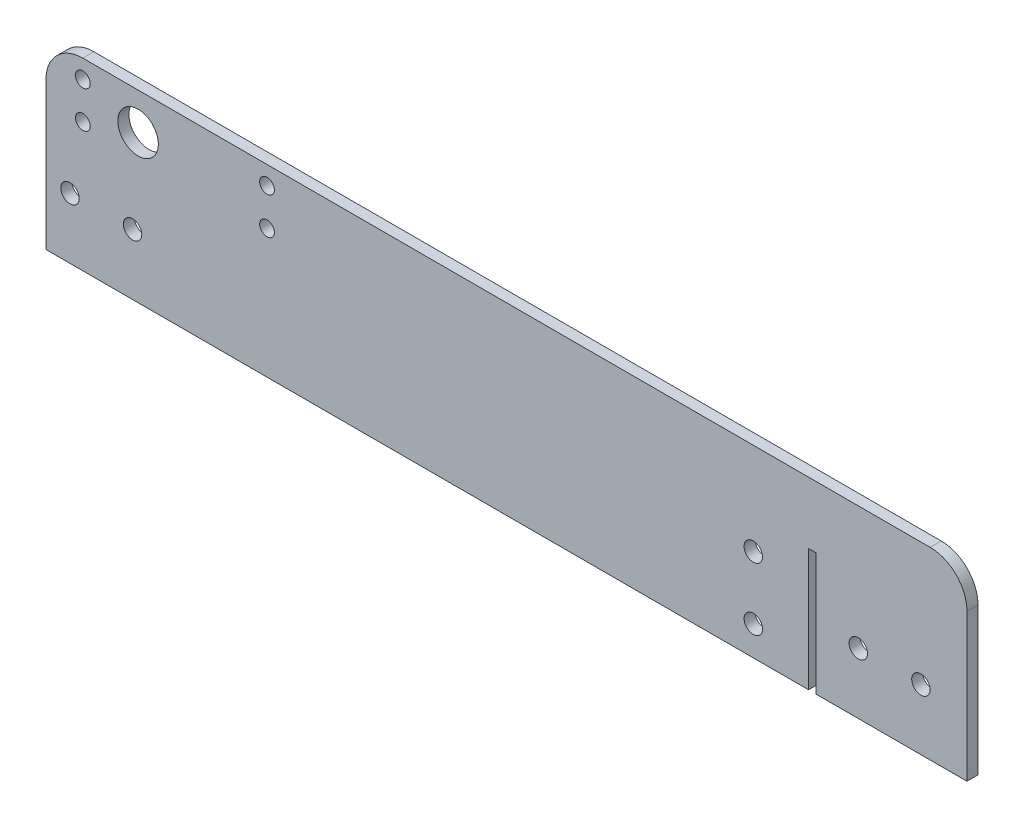
ISO-10303-21;
HEADER;
FILE_DESCRIPTION(('STEP AP214'),'2;1');
FILE_NAME('part.step','',(''),(''),'','','');
FILE_SCHEMA(('AUTOMOTIVE_DESIGN { 1 0 10303 214 1 1 1 1 }'));
ENDSEC;
DATA;
#1=APPLICATION_CONTEXT('core data for automotive mechanical design processes');
#2=APPLICATION_PROTOCOL_DEFINITION('international standard','automotive_design',2000,#1);
#3=PRODUCT_CONTEXT('',#1,'mechanical');
#4=PRODUCT('Part','Part','',(#3));
#5=PRODUCT_RELATED_PRODUCT_CATEGORY('part','',(#4));
#6=PRODUCT_DEFINITION_FORMATION('','',#4);
#7=PRODUCT_DEFINITION_CONTEXT('part definition',#1,'design');
#8=PRODUCT_DEFINITION('design','',#6,#7);
#9=PRODUCT_DEFINITION_SHAPE('','',#8);
#10=(LENGTH_UNIT() NAMED_UNIT(*) SI_UNIT(.MILLI.,.METRE.));
#11=(NAMED_UNIT(*) PLANE_ANGLE_UNIT() SI_UNIT($,.RADIAN.));
#12=(NAMED_UNIT(*) SI_UNIT($,.STERADIAN.) SOLID_ANGLE_UNIT());
#13=UNCERTAINTY_MEASURE_WITH_UNIT(LENGTH_MEASURE(1.E-05),#10,'distance_accuracy_value','');
#14=(GEOMETRIC_REPRESENTATION_CONTEXT(3) GLOBAL_UNCERTAINTY_ASSIGNED_CONTEXT((#13)) GLOBAL_UNIT_ASSIGNED_CONTEXT((#10,
#11,#12)) REPRESENTATION_CONTEXT('',''));
#15=CARTESIAN_POINT('',(0.,0.,0.));
#16=DIRECTION('',(0.,0.,1.));
#17=DIRECTION('',(1.,0.,0.));
#18=AXIS2_PLACEMENT_3D('',#15,#16,#17);
#19=CARTESIAN_POINT('',(10.,40.,1.5));
#20=DIRECTION('',(0.,0.,1.));
#21=DIRECTION('',(1.,0.,0.));
#22=AXIS2_PLACEMENT_3D('',#19,#20,#21);
#23=PLANE('',#22);
#24=CARTESIAN_POINT('',(192.,25.,1.5));
#25=DIRECTION('',(0.,0.,1.));
#26=DIRECTION('',(1.,0.,0.));
#27=AXIS2_PLACEMENT_3D('',#24,#25,#26);
#28=CIRCLE('',#27,2.5);
#29=CARTESIAN_POINT('',(194.5,25.,1.5));
#30=VERTEX_POINT('',#29);
#31=EDGE_CURVE('E186',#30,#30,#28,.T.);
#32=ORIENTED_EDGE('',*,*,#31,.F.);
#33=EDGE_LOOP('',(#32));
#34=FACE_BOUND('',#33,.T.);
#35=CARTESIAN_POINT('',(192.,8.,1.5));
#36=DIRECTION('',(0.,0.,1.));
#37=DIRECTION('',(1.,0.,0.));
#38=AXIS2_PLACEMENT_3D('',#35,#36,#37);
#39=CIRCLE('',#38,2.5);
#40=CARTESIAN_POINT('',(194.5,8.,1.5));
#41=VERTEX_POINT('',#40);
#42=EDGE_CURVE('E192',#41,#41,#39,.T.);
#43=ORIENTED_EDGE('',*,*,#42,.F.);
#44=EDGE_LOOP('',(#43));
#45=FACE_BOUND('',#44,.T.);
#46=CARTESIAN_POINT('',(220.5,16.5,1.5));
#47=DIRECTION('',(0.,0.,1.));
#48=DIRECTION('',(1.,0.,0.));
#49=AXIS2_PLACEMENT_3D('',#46,#47,#48);
#50=CIRCLE('',#49,2.5);
#51=CARTESIAN_POINT('',(223.,16.5,1.5));
#52=VERTEX_POINT('',#51);
#53=EDGE_CURVE('E205',#52,#52,#50,.T.);
#54=ORIENTED_EDGE('',*,*,#53,.F.);
#55=EDGE_LOOP('',(#54));
#56=FACE_BOUND('',#55,.T.);
#57=CARTESIAN_POINT('',(6.5,16.5,1.5));
#58=DIRECTION('',(0.,0.,1.));
#59=DIRECTION('',(1.,0.,0.));
#60=AXIS2_PLACEMENT_3D('',#57,#58,#59);
#61=CIRCLE('',#60,2.5);
#62=CARTESIAN_POINT('',(9.,16.5,1.5));
#63=VERTEX_POINT('',#62);
#64=EDGE_CURVE('E217',#63,#63,#61,.T.);
#65=ORIENTED_EDGE('',*,*,#64,.F.);
#66=EDGE_LOOP('',(#65));
#67=FACE_BOUND('',#66,.T.);
#68=CARTESIAN_POINT('',(60.,35.,1.5));
#69=DIRECTION('',(0.,0.,1.));
#70=DIRECTION('',(1.,0.,0.));
#71=AXIS2_PLACEMENT_3D('',#68,#69,#70);
#72=CIRCLE('',#71,2.);
#73=CARTESIAN_POINT('',(62.,35.,1.5));
#74=VERTEX_POINT('',#73);
#75=EDGE_CURVE('E229',#74,#74,#72,.T.);
#76=ORIENTED_EDGE('',*,*,#75,.F.);
#77=EDGE_LOOP('',(#76));
#78=FACE_BOUND('',#77,.T.);
#79=CARTESIAN_POINT('',(9.99999999999999,45.,1.5));
#80=DIRECTION('',(0.,0.,1.));
#81=DIRECTION('',(1.,0.,0.));
#82=AXIS2_PLACEMENT_3D('',#79,#80,#81);
#83=CIRCLE('',#82,2.);
#84=CARTESIAN_POINT('',(12.,45.,1.5));
#85=VERTEX_POINT('',#84);
#86=EDGE_CURVE('E241',#85,#85,#83,.T.);
#87=ORIENTED_EDGE('',*,*,#86,.F.);
#88=EDGE_LOOP('',(#87));
#89=FACE_BOUND('',#88,.T.);
#90=DIRECTION('',(0.,-1.,0.));
#91=VECTOR('',#90,1.);
#92=CARTESIAN_POINT('',(0.,0.,1.5));
#93=LINE('',#92,#91);
#94=CARTESIAN_POINT('',(0.,39.9999999999999,1.5));
#95=VERTEX_POINT('',#94);
#96=CARTESIAN_POINT('',(0.,0.,1.5));
#97=VERTEX_POINT('',#96);
#98=EDGE_CURVE('E167',#95,#97,#93,.T.);
#99=ORIENTED_EDGE('',*,*,#98,.T.);
#100=DIRECTION('',(1.,0.,0.));
#101=VECTOR('',#100,1.);
#102=CARTESIAN_POINT('',(0.,0.,1.5));
#103=LINE('',#102,#101);
#104=CARTESIAN_POINT('',(207.,0.,1.5));
#105=VERTEX_POINT('',#104);
#106=EDGE_CURVE('E105',#97,#105,#103,.T.);
#107=ORIENTED_EDGE('',*,*,#106,.T.);
#108=DIRECTION('',(0.,1.,0.));
#109=VECTOR('',#108,1.);
#110=CARTESIAN_POINT('',(207.,0.,1.5));
#111=LINE('',#110,#109);
#112=CARTESIAN_POINT('',(207.,33.2159245651267,1.5));
#113=VERTEX_POINT('',#112);
#114=EDGE_CURVE('E253',#105,#113,#111,.T.);
#115=ORIENTED_EDGE('',*,*,#114,.T.);
#116=DIRECTION('',(1.,0.,0.));
#117=VECTOR('',#116,1.);
#118=CARTESIAN_POINT('',(207.,33.2159245651267,1.5));
#119=LINE('',#118,#117);
#120=CARTESIAN_POINT('',(208.999329080325,33.2159245651267,1.5));
#121=VERTEX_POINT('',#120);
#122=EDGE_CURVE('E255',#113,#121,#119,.T.);
#123=ORIENTED_EDGE('',*,*,#122,.T.);
#124=DIRECTION('',(0.,-1.,0.));
#125=VECTOR('',#124,1.);
#126=CARTESIAN_POINT('',(208.999329080325,33.2159245651267,1.5));
#127=LINE('',#126,#125);
#128=CARTESIAN_POINT('',(208.999329080325,0.,1.5));
#129=VERTEX_POINT('',#128);
#130=EDGE_CURVE('E257',#121,#129,#127,.T.);
#131=ORIENTED_EDGE('',*,*,#130,.T.);
#132=DIRECTION('',(1.,0.,0.));
#133=VECTOR('',#132,1.);
#134=CARTESIAN_POINT('',(208.999329080325,0.,1.5));
#135=LINE('',#134,#133);
#136=CARTESIAN_POINT('',(250.,0.,1.5));
#137=VERTEX_POINT('',#136);
#138=EDGE_CURVE('E259',#129,#137,#135,.T.);
#139=ORIENTED_EDGE('',*,*,#138,.T.);
#140=DIRECTION('',(0.,1.,0.));
#141=VECTOR('',#140,1.);
#142=CARTESIAN_POINT('',(250.,0.,1.5));
#143=LINE('',#142,#141);
#144=CARTESIAN_POINT('',(250.,39.9999999999999,1.5));
#145=VERTEX_POINT('',#144);
#146=EDGE_CURVE('E130',#137,#145,#143,.T.);
#147=ORIENTED_EDGE('',*,*,#146,.T.);
#148=CARTESIAN_POINT('',(240.,40.,1.5));
#149=DIRECTION('',(0.,0.,1.));
#150=DIRECTION('',(1.,0.,0.));
#151=AXIS2_PLACEMENT_3D('',#148,#149,#150);
#152=CIRCLE('',#151,10.);
#153=CARTESIAN_POINT('',(240.,50.,1.5));
#154=VERTEX_POINT('',#153);
#155=EDGE_CURVE('E124',#145,#154,#152,.T.);
#156=ORIENTED_EDGE('',*,*,#155,.T.);
#157=DIRECTION('',(-1.,0.,0.));
#158=VECTOR('',#157,1.);
#159=CARTESIAN_POINT('',(10.0000000000001,50.,1.5));
#160=LINE('',#159,#158);
#161=CARTESIAN_POINT('',(10.0000000000001,50.,1.5));
#162=VERTEX_POINT('',#161);
#163=EDGE_CURVE('E128',#154,#162,#160,.T.);
#164=ORIENTED_EDGE('',*,*,#163,.T.);
#165=CARTESIAN_POINT('',(10.,40.,1.5));
#166=DIRECTION('',(0.,0.,1.));
#167=DIRECTION('',(1.,0.,0.));
#168=AXIS2_PLACEMENT_3D('',#165,#166,#167);
#169=CIRCLE('',#168,10.);
#170=EDGE_CURVE('E56',#162,#95,#169,.T.);
#171=ORIENTED_EDGE('',*,*,#170,.T.);
#172=EDGE_LOOP('',(#99,#107,#115,#123,#131,#139,#147,#156,#164,#171));
#173=FACE_BOUND('',#172,.T.);
#174=CARTESIAN_POINT('',(9.99999999999999,35.,1.5));
#175=DIRECTION('',(0.,0.,1.));
#176=DIRECTION('',(1.,0.,0.));
#177=AXIS2_PLACEMENT_3D('',#174,#175,#176);
#178=CIRCLE('',#177,2.);
#179=CARTESIAN_POINT('',(12.,35.,1.5));
#180=VERTEX_POINT('',#179);
#181=EDGE_CURVE('E152',#180,#180,#178,.T.);
#182=ORIENTED_EDGE('',*,*,#181,.F.);
#183=EDGE_LOOP('',(#182));
#184=FACE_BOUND('',#183,.T.);
#185=CARTESIAN_POINT('',(60.,45.,1.5));
#186=DIRECTION('',(0.,0.,1.));
#187=DIRECTION('',(1.,0.,0.));
#188=AXIS2_PLACEMENT_3D('',#185,#186,#187);
#189=CIRCLE('',#188,2.);
#190=CARTESIAN_POINT('',(62.,45.,1.5));
#191=VERTEX_POINT('',#190);
#192=EDGE_CURVE('E235',#191,#191,#189,.T.);
#193=ORIENTED_EDGE('',*,*,#192,.F.);
#194=EDGE_LOOP('',(#193));
#195=FACE_BOUND('',#194,.T.);
#196=CARTESIAN_POINT('',(25.,40.0000000000001,1.5));
#197=DIRECTION('',(0.,0.,1.));
#198=DIRECTION('',(1.,0.,0.));
#199=AXIS2_PLACEMENT_3D('',#196,#197,#198);
#200=CIRCLE('',#199,5.49999999999998);
#201=CARTESIAN_POINT('',(30.5,40.0000000000001,1.5));
#202=VERTEX_POINT('',#201);
#203=EDGE_CURVE('E223',#202,#202,#200,.T.);
#204=ORIENTED_EDGE('',*,*,#203,.F.);
#205=EDGE_LOOP('',(#204));
#206=FACE_BOUND('',#205,.T.);
#207=CARTESIAN_POINT('',(23.5,16.5,1.5));
#208=DIRECTION('',(0.,0.,1.));
#209=DIRECTION('',(1.,0.,0.));
#210=AXIS2_PLACEMENT_3D('',#207,#208,#209);
#211=CIRCLE('',#210,2.5);
#212=CARTESIAN_POINT('',(26.,16.5,1.5));
#213=VERTEX_POINT('',#212);
#214=EDGE_CURVE('E211',#213,#213,#211,.T.);
#215=ORIENTED_EDGE('',*,*,#214,.F.);
#216=EDGE_LOOP('',(#215));
#217=FACE_BOUND('',#216,.T.);
#218=CARTESIAN_POINT('',(237.5,16.5,1.5));
#219=DIRECTION('',(0.,0.,1.));
#220=DIRECTION('',(1.,0.,0.));
#221=AXIS2_PLACEMENT_3D('',#218,#219,#220);
#222=CIRCLE('',#221,2.5);
#223=CARTESIAN_POINT('',(240.,16.5,1.5));
#224=VERTEX_POINT('',#223);
#225=EDGE_CURVE('E199',#224,#224,#222,.T.);
#226=ORIENTED_EDGE('',*,*,#225,.F.);
#227=EDGE_LOOP('',(#226));
#228=FACE_BOUND('',#227,.T.);
#229=ADVANCED_FACE('F37',(#34,#45,#56,#67,#78,#89,#173,#184,#195,#206,#217,#228),#23,.T.);
#230=CARTESIAN_POINT('',(10.,40.,-1.5));
#231=DIRECTION('',(0.,0.,1.));
#232=DIRECTION('',(1.,0.,0.));
#233=AXIS2_PLACEMENT_3D('',#230,#231,#232);
#234=PLANE('',#233);
#235=CARTESIAN_POINT('',(192.,25.,-1.5));
#236=DIRECTION('',(0.,0.,1.));
#237=DIRECTION('',(1.,0.,0.));
#238=AXIS2_PLACEMENT_3D('',#235,#236,#237);
#239=CIRCLE('',#238,2.5);
#240=CARTESIAN_POINT('',(194.5,25.,-1.5));
#241=VERTEX_POINT('',#240);
#242=EDGE_CURVE('E41',#241,#241,#239,.T.);
#243=ORIENTED_EDGE('',*,*,#242,.T.);
#244=EDGE_LOOP('',(#243));
#245=FACE_BOUND('',#244,.T.);
#246=CARTESIAN_POINT('',(192.,8.,-1.5));
#247=DIRECTION('',(0.,0.,1.));
#248=DIRECTION('',(1.,0.,0.));
#249=AXIS2_PLACEMENT_3D('',#246,#247,#248);
#250=CIRCLE('',#249,2.5);
#251=CARTESIAN_POINT('',(194.5,8.,-1.5));
#252=VERTEX_POINT('',#251);
#253=EDGE_CURVE('E184',#252,#252,#250,.T.);
#254=ORIENTED_EDGE('',*,*,#253,.T.);
#255=EDGE_LOOP('',(#254));
#256=FACE_BOUND('',#255,.T.);
#257=DIRECTION('',(0.,-1.,0.));
#258=VECTOR('',#257,1.);
#259=CARTESIAN_POINT('',(0.,0.,-1.5));
#260=LINE('',#259,#258);
#261=CARTESIAN_POINT('',(0.,39.9999999999999,-1.5));
#262=VERTEX_POINT('',#261);
#263=CARTESIAN_POINT('',(0.,0.,-1.5));
#264=VERTEX_POINT('',#263);
#265=EDGE_CURVE('E148',#262,#264,#260,.T.);
#266=ORIENTED_EDGE('',*,*,#265,.F.);
#267=CARTESIAN_POINT('',(10.,40.,-1.5));
#268=DIRECTION('',(0.,0.,1.));
#269=DIRECTION('',(1.,0.,0.));
#270=AXIS2_PLACEMENT_3D('',#267,#268,#269);
#271=CIRCLE('',#270,10.);
#272=CARTESIAN_POINT('',(10.0000000000001,50.,-1.5));
#273=VERTEX_POINT('',#272);
#274=EDGE_CURVE('E97',#273,#262,#271,.T.);
#275=ORIENTED_EDGE('',*,*,#274,.F.);
#276=DIRECTION('',(-1.,0.,0.));
#277=VECTOR('',#276,1.);
#278=CARTESIAN_POINT('',(10.0000000000001,50.,-1.5));
#279=LINE('',#278,#277);
#280=CARTESIAN_POINT('',(240.,50.,-1.5));
#281=VERTEX_POINT('',#280);
#282=EDGE_CURVE('E91',#281,#273,#279,.T.);
#283=ORIENTED_EDGE('',*,*,#282,.F.);
#284=CARTESIAN_POINT('',(240.,40.,-1.5));
#285=DIRECTION('',(0.,0.,1.));
#286=DIRECTION('',(1.,0.,0.));
#287=AXIS2_PLACEMENT_3D('',#284,#285,#286);
#288=CIRCLE('',#287,10.);
#289=CARTESIAN_POINT('',(250.,39.9999999999999,-1.5));
#290=VERTEX_POINT('',#289);
#291=EDGE_CURVE('E138',#290,#281,#288,.T.);
#292=ORIENTED_EDGE('',*,*,#291,.F.);
#293=DIRECTION('',(0.,1.,0.));
#294=VECTOR('',#293,1.);
#295=CARTESIAN_POINT('',(250.,0.,-1.5));
#296=LINE('',#295,#294);
#297=CARTESIAN_POINT('',(250.,0.,-1.5));
#298=VERTEX_POINT('',#297);
#299=EDGE_CURVE('E162',#298,#290,#296,.T.);
#300=ORIENTED_EDGE('',*,*,#299,.F.);
#301=DIRECTION('',(1.,0.,0.));
#302=VECTOR('',#301,1.);
#303=CARTESIAN_POINT('',(208.999329080325,0.,-1.5));
#304=LINE('',#303,#302);
#305=CARTESIAN_POINT('',(208.999329080325,0.,-1.5));
#306=VERTEX_POINT('',#305);
#307=EDGE_CURVE('E160',#306,#298,#304,.T.);
#308=ORIENTED_EDGE('',*,*,#307,.F.);
#309=DIRECTION('',(0.,-1.,0.));
#310=VECTOR('',#309,1.);
#311=CARTESIAN_POINT('',(208.999329080325,33.2159245651267,-1.5));
#312=LINE('',#311,#310);
#313=CARTESIAN_POINT('',(208.999329080325,33.2159245651267,-1.5));
#314=VERTEX_POINT('',#313);
#315=EDGE_CURVE('E158',#314,#306,#312,.T.);
#316=ORIENTED_EDGE('',*,*,#315,.F.);
#317=DIRECTION('',(1.,0.,0.));
#318=VECTOR('',#317,1.);
#319=CARTESIAN_POINT('',(207.,33.2159245651267,-1.5));
#320=LINE('',#319,#318);
#321=CARTESIAN_POINT('',(207.,33.2159245651267,-1.5));
#322=VERTEX_POINT('',#321);
#323=EDGE_CURVE('E156',#322,#314,#320,.T.);
#324=ORIENTED_EDGE('',*,*,#323,.F.);
#325=DIRECTION('',(0.,1.,0.));
#326=VECTOR('',#325,1.);
#327=CARTESIAN_POINT('',(207.,0.,-1.5));
#328=LINE('',#327,#326);
#329=CARTESIAN_POINT('',(207.,0.,-1.5));
#330=VERTEX_POINT('',#329);
#331=EDGE_CURVE('E154',#330,#322,#328,.T.);
#332=ORIENTED_EDGE('',*,*,#331,.F.);
#333=DIRECTION('',(1.,0.,0.));
#334=VECTOR('',#333,1.);
#335=CARTESIAN_POINT('',(120.,0.,-1.5));
#336=LINE('',#335,#334);
#337=EDGE_CURVE('E151',#264,#330,#336,.T.);
#338=ORIENTED_EDGE('',*,*,#337,.F.);
#339=EDGE_LOOP('',(#266,#275,#283,#292,#300,#308,#316,#324,#332,#338));
#340=FACE_BOUND('',#339,.T.);
#341=CARTESIAN_POINT('',(9.99999999999999,35.,-1.5));
#342=DIRECTION('',(0.,0.,1.));
#343=DIRECTION('',(1.,0.,0.));
#344=AXIS2_PLACEMENT_3D('',#341,#342,#343);
#345=CIRCLE('',#344,2.);
#346=CARTESIAN_POINT('',(12.,35.,-1.5));
#347=VERTEX_POINT('',#346);
#348=EDGE_CURVE('E244',#347,#347,#345,.T.);
#349=ORIENTED_EDGE('',*,*,#348,.T.);
#350=EDGE_LOOP('',(#349));
#351=FACE_BOUND('',#350,.T.);
#352=CARTESIAN_POINT('',(9.99999999999999,45.,-1.5));
#353=DIRECTION('',(0.,0.,1.));
#354=DIRECTION('',(1.,0.,0.));
#355=AXIS2_PLACEMENT_3D('',#352,#353,#354);
#356=CIRCLE('',#355,2.);
#357=CARTESIAN_POINT('',(12.,45.,-1.5));
#358=VERTEX_POINT('',#357);
#359=EDGE_CURVE('E238',#358,#358,#356,.T.);
#360=ORIENTED_EDGE('',*,*,#359,.T.);
#361=EDGE_LOOP('',(#360));
#362=FACE_BOUND('',#361,.T.);
#363=CARTESIAN_POINT('',(60.,45.,-1.5));
#364=DIRECTION('',(0.,0.,1.));
#365=DIRECTION('',(1.,0.,0.));
#366=AXIS2_PLACEMENT_3D('',#363,#364,#365);
#367=CIRCLE('',#366,2.);
#368=CARTESIAN_POINT('',(62.,45.,-1.5));
#369=VERTEX_POINT('',#368);
#370=EDGE_CURVE('E232',#369,#369,#367,.T.);
#371=ORIENTED_EDGE('',*,*,#370,.T.);
#372=EDGE_LOOP('',(#371));
#373=FACE_BOUND('',#372,.T.);
#374=CARTESIAN_POINT('',(60.,35.,-1.5));
#375=DIRECTION('',(0.,0.,1.));
#376=DIRECTION('',(1.,0.,0.));
#377=AXIS2_PLACEMENT_3D('',#374,#375,#376);
#378=CIRCLE('',#377,2.);
#379=CARTESIAN_POINT('',(62.,35.,-1.5));
#380=VERTEX_POINT('',#379);
#381=EDGE_CURVE('E226',#380,#380,#378,.T.);
#382=ORIENTED_EDGE('',*,*,#381,.T.);
#383=EDGE_LOOP('',(#382));
#384=FACE_BOUND('',#383,.T.);
#385=CARTESIAN_POINT('',(25.,40.0000000000001,-1.5));
#386=DIRECTION('',(0.,0.,1.));
#387=DIRECTION('',(1.,0.,0.));
#388=AXIS2_PLACEMENT_3D('',#385,#386,#387);
#389=CIRCLE('',#388,5.49999999999998);
#390=CARTESIAN_POINT('',(30.5,40.0000000000001,-1.5));
#391=VERTEX_POINT('',#390);
#392=EDGE_CURVE('E220',#391,#391,#389,.T.);
#393=ORIENTED_EDGE('',*,*,#392,.T.);
#394=EDGE_LOOP('',(#393));
#395=FACE_BOUND('',#394,.T.);
#396=CARTESIAN_POINT('',(6.5,16.5,-1.5));
#397=DIRECTION('',(0.,0.,1.));
#398=DIRECTION('',(1.,0.,0.));
#399=AXIS2_PLACEMENT_3D('',#396,#397,#398);
#400=CIRCLE('',#399,2.5);
#401=CARTESIAN_POINT('',(9.,16.5,-1.5));
#402=VERTEX_POINT('',#401);
#403=EDGE_CURVE('E214',#402,#402,#400,.T.);
#404=ORIENTED_EDGE('',*,*,#403,.T.);
#405=EDGE_LOOP('',(#404));
#406=FACE_BOUND('',#405,.T.);
#407=CARTESIAN_POINT('',(23.5,16.5,-1.5));
#408=DIRECTION('',(0.,0.,1.));
#409=DIRECTION('',(1.,0.,0.));
#410=AXIS2_PLACEMENT_3D('',#407,#408,#409);
#411=CIRCLE('',#410,2.5);
#412=CARTESIAN_POINT('',(26.,16.5,-1.5));
#413=VERTEX_POINT('',#412);
#414=EDGE_CURVE('E208',#413,#413,#411,.T.);
#415=ORIENTED_EDGE('',*,*,#414,.T.);
#416=EDGE_LOOP('',(#415));
#417=FACE_BOUND('',#416,.T.);
#418=CARTESIAN_POINT('',(220.5,16.5,-1.5));
#419=DIRECTION('',(0.,0.,1.));
#420=DIRECTION('',(1.,0.,0.));
#421=AXIS2_PLACEMENT_3D('',#418,#419,#420);
#422=CIRCLE('',#421,2.5);
#423=CARTESIAN_POINT('',(223.,16.5,-1.5));
#424=VERTEX_POINT('',#423);
#425=EDGE_CURVE('E202',#424,#424,#422,.T.);
#426=ORIENTED_EDGE('',*,*,#425,.T.);
#427=EDGE_LOOP('',(#426));
#428=FACE_BOUND('',#427,.T.);
#429=CARTESIAN_POINT('',(237.5,16.5,-1.5));
#430=DIRECTION('',(0.,0.,1.));
#431=DIRECTION('',(1.,0.,0.));
#432=AXIS2_PLACEMENT_3D('',#429,#430,#431);
#433=CIRCLE('',#432,2.5);
#434=CARTESIAN_POINT('',(240.,16.5,-1.5));
#435=VERTEX_POINT('',#434);
#436=EDGE_CURVE('E190',#435,#435,#433,.T.);
#437=ORIENTED_EDGE('',*,*,#436,.T.);
#438=EDGE_LOOP('',(#437));
#439=FACE_BOUND('',#438,.T.);
#440=ADVANCED_FACE('F272',(#245,#256,#340,#351,#362,#373,#384,#395,#406,#417,#428,#439),#234,.F.);
#441=CARTESIAN_POINT('',(0.,0.,1.5));
#442=DIRECTION('',(1.,0.,0.));
#443=DIRECTION('',(0.,0.,-1.));
#444=AXIS2_PLACEMENT_3D('',#441,#442,#443);
#445=PLANE('',#444);
#446=ORIENTED_EDGE('',*,*,#265,.T.);
#447=DIRECTION('',(0.,0.,-1.));
#448=VECTOR('',#447,1.);
#449=CARTESIAN_POINT('',(0.,0.,1.5));
#450=LINE('',#449,#448);
#451=EDGE_CURVE('E11',#97,#264,#450,.T.);
#452=ORIENTED_EDGE('',*,*,#451,.F.);
#453=ORIENTED_EDGE('',*,*,#98,.F.);
#454=DIRECTION('',(0.,0.,-1.));
#455=VECTOR('',#454,1.);
#456=CARTESIAN_POINT('',(0.,39.9999999999999,1.5));
#457=LINE('',#456,#455);
#458=EDGE_CURVE('E144',#95,#262,#457,.T.);
#459=ORIENTED_EDGE('',*,*,#458,.T.);
#460=EDGE_LOOP('',(#446,#452,#453,#459));
#461=FACE_BOUND('',#460,.T.);
#462=ADVANCED_FACE('F39',(#461),#445,.F.);
#463=CARTESIAN_POINT('',(120.,0.,1.5));
#464=DIRECTION('',(0.,1.,0.));
#465=DIRECTION('',(0.,0.,1.));
#466=AXIS2_PLACEMENT_3D('',#463,#464,#465);
#467=PLANE('',#466);
#468=ORIENTED_EDGE('',*,*,#337,.T.);
#469=DIRECTION('',(0.,0.,-1.));
#470=VECTOR('',#469,1.);
#471=CARTESIAN_POINT('',(207.,0.,1.5));
#472=LINE('',#471,#470);
#473=EDGE_CURVE('E47',#105,#330,#472,.T.);
#474=ORIENTED_EDGE('',*,*,#473,.F.);
#475=ORIENTED_EDGE('',*,*,#106,.F.);
#476=ORIENTED_EDGE('',*,*,#451,.T.);
#477=EDGE_LOOP('',(#468,#474,#475,#476));
#478=FACE_BOUND('',#477,.T.);
#479=ADVANCED_FACE('F454',(#478),#467,.F.);
#480=CARTESIAN_POINT('',(207.,0.,1.5));
#481=DIRECTION('',(-1.,0.,0.));
#482=DIRECTION('',(0.,-1.,0.));
#483=AXIS2_PLACEMENT_3D('',#480,#481,#482);
#484=PLANE('',#483);
#485=ORIENTED_EDGE('',*,*,#331,.T.);
#486=DIRECTION('',(0.,0.,-1.));
#487=VECTOR('',#486,1.);
#488=CARTESIAN_POINT('',(207.,33.2159245651267,1.5));
#489=LINE('',#488,#487);
#490=EDGE_CURVE('E180',#113,#322,#489,.T.);
#491=ORIENTED_EDGE('',*,*,#490,.F.);
#492=ORIENTED_EDGE('',*,*,#114,.F.);
#493=ORIENTED_EDGE('',*,*,#473,.T.);
#494=EDGE_LOOP('',(#485,#491,#492,#493));
#495=FACE_BOUND('',#494,.T.);
#496=ADVANCED_FACE('F443',(#495),#484,.F.);
#497=CARTESIAN_POINT('',(207.,33.2159245651267,1.5));
#498=DIRECTION('',(0.,1.,0.));
#499=DIRECTION('',(0.,0.,1.));
#500=AXIS2_PLACEMENT_3D('',#497,#498,#499);
#501=PLANE('',#500);
#502=ORIENTED_EDGE('',*,*,#323,.T.);
#503=DIRECTION('',(0.,0.,-1.));
#504=VECTOR('',#503,1.);
#505=CARTESIAN_POINT('',(208.999329080325,33.2159245651267,1.5));
#506=LINE('',#505,#504);
#507=EDGE_CURVE('E177',#121,#314,#506,.T.);
#508=ORIENTED_EDGE('',*,*,#507,.F.);
#509=ORIENTED_EDGE('',*,*,#122,.F.);
#510=ORIENTED_EDGE('',*,*,#490,.T.);
#511=EDGE_LOOP('',(#502,#508,#509,#510));
#512=FACE_BOUND('',#511,.T.);
#513=ADVANCED_FACE('F432',(#512),#501,.F.);
#514=CARTESIAN_POINT('',(208.999329080325,33.2159245651267,1.5));
#515=DIRECTION('',(1.,0.,0.));
#516=DIRECTION('',(0.,0.,-1.));
#517=AXIS2_PLACEMENT_3D('',#514,#515,#516);
#518=PLANE('',#517);
#519=ORIENTED_EDGE('',*,*,#315,.T.);
#520=DIRECTION('',(0.,0.,-1.));
#521=VECTOR('',#520,1.);
#522=CARTESIAN_POINT('',(208.999329080325,0.,1.5));
#523=LINE('',#522,#521);
#524=EDGE_CURVE('E174',#129,#306,#523,.T.);
#525=ORIENTED_EDGE('',*,*,#524,.F.);
#526=ORIENTED_EDGE('',*,*,#130,.F.);
#527=ORIENTED_EDGE('',*,*,#507,.T.);
#528=EDGE_LOOP('',(#519,#525,#526,#527));
#529=FACE_BOUND('',#528,.T.);
#530=ADVANCED_FACE('F422',(#529),#518,.F.);
#531=CARTESIAN_POINT('',(208.999329080325,0.,1.5));
#532=DIRECTION('',(0.,1.,0.));
#533=DIRECTION('',(0.,0.,1.));
#534=AXIS2_PLACEMENT_3D('',#531,#532,#533);
#535=PLANE('',#534);
#536=ORIENTED_EDGE('',*,*,#307,.T.);
#537=DIRECTION('',(0.,0.,-1.));
#538=VECTOR('',#537,1.);
#539=CARTESIAN_POINT('',(250.,0.,1.5));
#540=LINE('',#539,#538);
#541=EDGE_CURVE('E171',#137,#298,#540,.T.);
#542=ORIENTED_EDGE('',*,*,#541,.F.);
#543=ORIENTED_EDGE('',*,*,#138,.F.);
#544=ORIENTED_EDGE('',*,*,#524,.T.);
#545=EDGE_LOOP('',(#536,#542,#543,#544));
#546=FACE_BOUND('',#545,.T.);
#547=ADVANCED_FACE('F265',(#546),#535,.F.);
#548=CARTESIAN_POINT('',(250.,0.,1.5));
#549=DIRECTION('',(-1.,0.,0.));
#550=DIRECTION('',(0.,0.,1.));
#551=AXIS2_PLACEMENT_3D('',#548,#549,#550);
#552=PLANE('',#551);
#553=ORIENTED_EDGE('',*,*,#299,.T.);
#554=DIRECTION('',(0.,0.,-1.));
#555=VECTOR('',#554,1.);
#556=CARTESIAN_POINT('',(250.,39.9999999999999,1.5));
#557=LINE('',#556,#555);
#558=EDGE_CURVE('E139',#145,#290,#557,.T.);
#559=ORIENTED_EDGE('',*,*,#558,.F.);
#560=ORIENTED_EDGE('',*,*,#146,.F.);
#561=ORIENTED_EDGE('',*,*,#541,.T.);
#562=EDGE_LOOP('',(#553,#559,#560,#561));
#563=FACE_BOUND('',#562,.T.);
#564=ADVANCED_FACE('F269',(#563),#552,.F.);
#565=CARTESIAN_POINT('',(240.,40.,1.5));
#566=DIRECTION('',(0.,0.,-1.));
#567=DIRECTION('',(-1.,0.,0.));
#568=AXIS2_PLACEMENT_3D('',#565,#566,#567);
#569=CYLINDRICAL_SURFACE('',#568,10.);
#570=ORIENTED_EDGE('',*,*,#291,.T.);
#571=DIRECTION('',(0.,0.,-1.));
#572=VECTOR('',#571,1.);
#573=CARTESIAN_POINT('',(240.,50.,1.5));
#574=LINE('',#573,#572);
#575=EDGE_CURVE('E135',#154,#281,#574,.T.);
#576=ORIENTED_EDGE('',*,*,#575,.F.);
#577=ORIENTED_EDGE('',*,*,#155,.F.);
#578=ORIENTED_EDGE('',*,*,#558,.T.);
#579=EDGE_LOOP('',(#570,#576,#577,#578));
#580=FACE_BOUND('',#579,.T.);
#581=ADVANCED_FACE('F136',(#580),#569,.T.);
#582=CARTESIAN_POINT('',(10.0000000000001,50.,1.5));
#583=DIRECTION('',(0.,-1.,0.));
#584=DIRECTION('',(0.,0.,-1.));
#585=AXIS2_PLACEMENT_3D('',#582,#583,#584);
#586=PLANE('',#585);
#587=ORIENTED_EDGE('',*,*,#282,.T.);
#588=DIRECTION('',(0.,0.,-1.));
#589=VECTOR('',#588,1.);
#590=CARTESIAN_POINT('',(10.0000000000001,50.,1.5));
#591=LINE('',#590,#589);
#592=EDGE_CURVE('E140',#162,#273,#591,.T.);
#593=ORIENTED_EDGE('',*,*,#592,.F.);
#594=ORIENTED_EDGE('',*,*,#163,.F.);
#595=ORIENTED_EDGE('',*,*,#575,.T.);
#596=EDGE_LOOP('',(#587,#593,#594,#595));
#597=FACE_BOUND('',#596,.T.);
#598=ADVANCED_FACE('F142',(#597),#586,.F.);
#599=CARTESIAN_POINT('',(10.,40.,1.5));
#600=DIRECTION('',(0.,0.,-1.));
#601=DIRECTION('',(-1.,0.,0.));
#602=AXIS2_PLACEMENT_3D('',#599,#600,#601);
#603=CYLINDRICAL_SURFACE('',#602,10.);
#604=ORIENTED_EDGE('',*,*,#274,.T.);
#605=ORIENTED_EDGE('',*,*,#458,.F.);
#606=ORIENTED_EDGE('',*,*,#170,.F.);
#607=ORIENTED_EDGE('',*,*,#592,.T.);
#608=EDGE_LOOP('',(#604,#605,#606,#607));
#609=FACE_BOUND('',#608,.T.);
#610=ADVANCED_FACE('F278',(#609),#603,.T.);
#611=CARTESIAN_POINT('',(9.99999999999999,35.,1.5));
#612=DIRECTION('',(0.,0.,-1.));
#613=DIRECTION('',(-1.,0.,0.));
#614=AXIS2_PLACEMENT_3D('',#611,#612,#613);
#615=CYLINDRICAL_SURFACE('',#614,2.);
#616=ORIENTED_EDGE('',*,*,#181,.T.);
#617=EDGE_LOOP('',(#616));
#618=FACE_BOUND('',#617,.T.);
#619=ORIENTED_EDGE('',*,*,#348,.F.);
#620=EDGE_LOOP('',(#619));
#621=FACE_BOUND('',#620,.T.);
#622=ADVANCED_FACE('F280',(#618,#621),#615,.F.);
#623=CARTESIAN_POINT('',(9.99999999999999,45.,1.5));
#624=DIRECTION('',(0.,0.,-1.));
#625=DIRECTION('',(-1.,0.,0.));
#626=AXIS2_PLACEMENT_3D('',#623,#624,#625);
#627=CYLINDRICAL_SURFACE('',#626,2.);
#628=ORIENTED_EDGE('',*,*,#86,.T.);
#629=EDGE_LOOP('',(#628));
#630=FACE_BOUND('',#629,.T.);
#631=ORIENTED_EDGE('',*,*,#359,.F.);
#632=EDGE_LOOP('',(#631));
#633=FACE_BOUND('',#632,.T.);
#634=ADVANCED_FACE('F286',(#630,#633),#627,.F.);
#635=CARTESIAN_POINT('',(60.,45.,1.5));
#636=DIRECTION('',(0.,0.,-1.));
#637=DIRECTION('',(-1.,0.,0.));
#638=AXIS2_PLACEMENT_3D('',#635,#636,#637);
#639=CYLINDRICAL_SURFACE('',#638,2.);
#640=ORIENTED_EDGE('',*,*,#192,.T.);
#641=EDGE_LOOP('',(#640));
#642=FACE_BOUND('',#641,.T.);
#643=ORIENTED_EDGE('',*,*,#370,.F.);
#644=EDGE_LOOP('',(#643));
#645=FACE_BOUND('',#644,.T.);
#646=ADVANCED_FACE('F302',(#642,#645),#639,.F.);
#647=CARTESIAN_POINT('',(60.,35.,1.5));
#648=DIRECTION('',(0.,0.,-1.));
#649=DIRECTION('',(-1.,0.,0.));
#650=AXIS2_PLACEMENT_3D('',#647,#648,#649);
#651=CYLINDRICAL_SURFACE('',#650,2.);
#652=ORIENTED_EDGE('',*,*,#75,.T.);
#653=EDGE_LOOP('',(#652));
#654=FACE_BOUND('',#653,.T.);
#655=ORIENTED_EDGE('',*,*,#381,.F.);
#656=EDGE_LOOP('',(#655));
#657=FACE_BOUND('',#656,.T.);
#658=ADVANCED_FACE('F306',(#654,#657),#651,.F.);
#659=CARTESIAN_POINT('',(25.,40.0000000000001,1.5));
#660=DIRECTION('',(0.,0.,-1.));
#661=DIRECTION('',(-1.,0.,0.));
#662=AXIS2_PLACEMENT_3D('',#659,#660,#661);
#663=CYLINDRICAL_SURFACE('',#662,5.49999999999998);
#664=ORIENTED_EDGE('',*,*,#203,.T.);
#665=EDGE_LOOP('',(#664));
#666=FACE_BOUND('',#665,.T.);
#667=ORIENTED_EDGE('',*,*,#392,.F.);
#668=EDGE_LOOP('',(#667));
#669=FACE_BOUND('',#668,.T.);
#670=ADVANCED_FACE('F310',(#666,#669),#663,.F.);
#671=CARTESIAN_POINT('',(6.5,16.5,1.5));
#672=DIRECTION('',(0.,0.,-1.));
#673=DIRECTION('',(-1.,0.,0.));
#674=AXIS2_PLACEMENT_3D('',#671,#672,#673);
#675=CYLINDRICAL_SURFACE('',#674,2.5);
#676=ORIENTED_EDGE('',*,*,#64,.T.);
#677=EDGE_LOOP('',(#676));
#678=FACE_BOUND('',#677,.T.);
#679=ORIENTED_EDGE('',*,*,#403,.F.);
#680=EDGE_LOOP('',(#679));
#681=FACE_BOUND('',#680,.T.);
#682=ADVANCED_FACE('F314',(#678,#681),#675,.F.);
#683=CARTESIAN_POINT('',(23.5,16.5,1.5));
#684=DIRECTION('',(0.,0.,-1.));
#685=DIRECTION('',(-1.,0.,0.));
#686=AXIS2_PLACEMENT_3D('',#683,#684,#685);
#687=CYLINDRICAL_SURFACE('',#686,2.5);
#688=ORIENTED_EDGE('',*,*,#214,.T.);
#689=EDGE_LOOP('',(#688));
#690=FACE_BOUND('',#689,.T.);
#691=ORIENTED_EDGE('',*,*,#414,.F.);
#692=EDGE_LOOP('',(#691));
#693=FACE_BOUND('',#692,.T.);
#694=ADVANCED_FACE('F318',(#690,#693),#687,.F.);
#695=CARTESIAN_POINT('',(220.5,16.5,1.5));
#696=DIRECTION('',(0.,0.,-1.));
#697=DIRECTION('',(-1.,0.,0.));
#698=AXIS2_PLACEMENT_3D('',#695,#696,#697);
#699=CYLINDRICAL_SURFACE('',#698,2.5);
#700=ORIENTED_EDGE('',*,*,#53,.T.);
#701=EDGE_LOOP('',(#700));
#702=FACE_BOUND('',#701,.T.);
#703=ORIENTED_EDGE('',*,*,#425,.F.);
#704=EDGE_LOOP('',(#703));
#705=FACE_BOUND('',#704,.T.);
#706=ADVANCED_FACE('F322',(#702,#705),#699,.F.);
#707=CARTESIAN_POINT('',(237.5,16.5,1.5));
#708=DIRECTION('',(0.,0.,-1.));
#709=DIRECTION('',(-1.,0.,0.));
#710=AXIS2_PLACEMENT_3D('',#707,#708,#709);
#711=CYLINDRICAL_SURFACE('',#710,2.5);
#712=ORIENTED_EDGE('',*,*,#225,.T.);
#713=EDGE_LOOP('',(#712));
#714=FACE_BOUND('',#713,.T.);
#715=ORIENTED_EDGE('',*,*,#436,.F.);
#716=EDGE_LOOP('',(#715));
#717=FACE_BOUND('',#716,.T.);
#718=ADVANCED_FACE('F326',(#714,#717),#711,.F.);
#719=CARTESIAN_POINT('',(192.,8.,-8.5));
#720=DIRECTION('',(0.,0.,1.));
#721=DIRECTION('',(1.,0.,0.));
#722=AXIS2_PLACEMENT_3D('',#719,#720,#721);
#723=CYLINDRICAL_SURFACE('',#722,2.5);
#724=ORIENTED_EDGE('',*,*,#42,.T.);
#725=EDGE_LOOP('',(#724));
#726=FACE_BOUND('',#725,.T.);
#727=ORIENTED_EDGE('',*,*,#253,.F.);
#728=EDGE_LOOP('',(#727));
#729=FACE_BOUND('',#728,.T.);
#730=ADVANCED_FACE('F330',(#726,#729),#723,.F.);
#731=CARTESIAN_POINT('',(192.,25.,-8.5));
#732=DIRECTION('',(0.,0.,1.));
#733=DIRECTION('',(1.,0.,0.));
#734=AXIS2_PLACEMENT_3D('',#731,#732,#733);
#735=CYLINDRICAL_SURFACE('',#734,2.5);
#736=ORIENTED_EDGE('',*,*,#31,.T.);
#737=EDGE_LOOP('',(#736));
#738=FACE_BOUND('',#737,.T.);
#739=ORIENTED_EDGE('',*,*,#242,.F.);
#740=EDGE_LOOP('',(#739));
#741=FACE_BOUND('',#740,.T.);
#742=ADVANCED_FACE('F334',(#738,#741),#735,.F.);
#743=CLOSED_SHELL('',(#229,#440,#462,#479,#496,#513,#530,#547,#564,#581,#598,#610,#622,#634,
#646,#658,#670,#682,#694,#706,#718,#730,#742));
#744=MANIFOLD_SOLID_BREP('B2',#743);
#745=ADVANCED_BREP_SHAPE_REPRESENTATION('',(#18,#744),#14);
#746=SHAPE_DEFINITION_REPRESENTATION(#9,#745);
ENDSEC;
END-ISO-10303-21;
